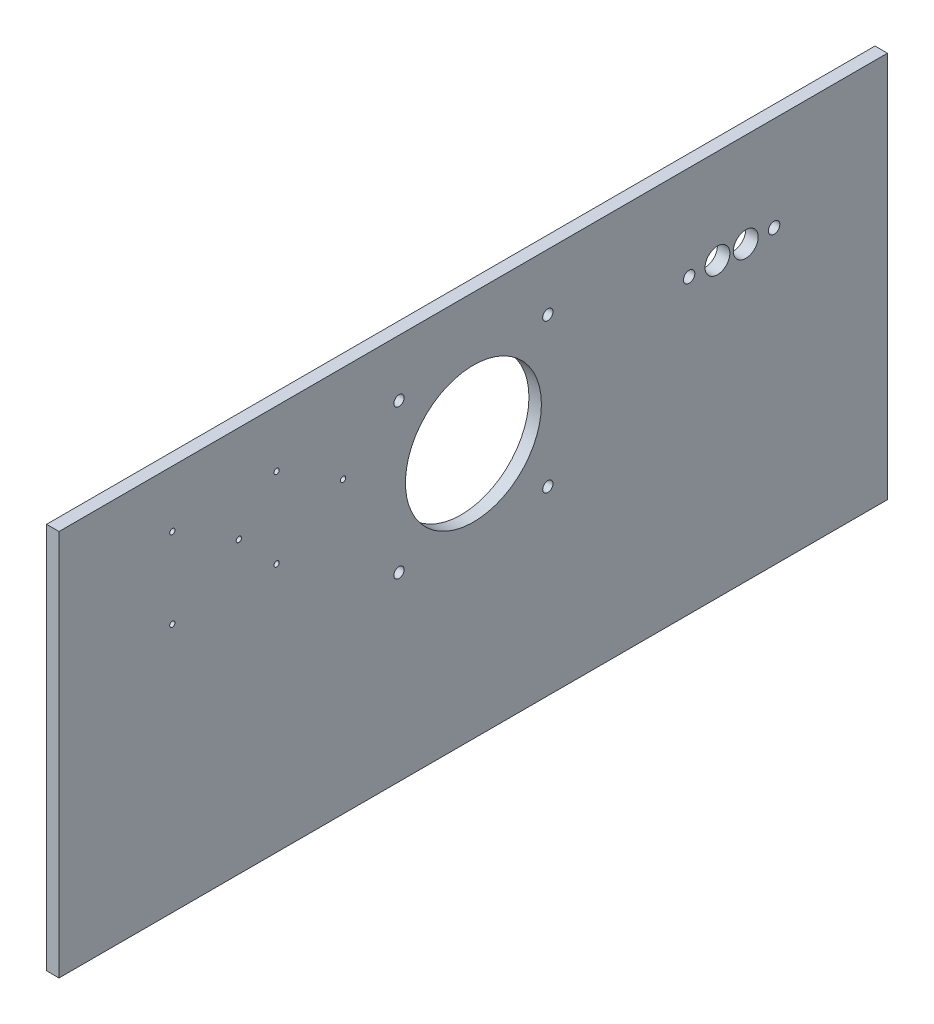
ISO-10303-21;
HEADER;
FILE_DESCRIPTION(('STEP AP214'),'2;1');
FILE_NAME('part.step','',(''),(''),'','','');
FILE_SCHEMA(('AUTOMOTIVE_DESIGN { 1 0 10303 214 1 1 1 1 }'));
ENDSEC;
DATA;
#1=APPLICATION_CONTEXT('core data for automotive mechanical design processes');
#2=APPLICATION_PROTOCOL_DEFINITION('international standard','automotive_design',2000,#1);
#3=PRODUCT_CONTEXT('',#1,'mechanical');
#4=PRODUCT('Part','Part','',(#3));
#5=PRODUCT_RELATED_PRODUCT_CATEGORY('part','',(#4));
#6=PRODUCT_DEFINITION_FORMATION('','',#4);
#7=PRODUCT_DEFINITION_CONTEXT('part definition',#1,'design');
#8=PRODUCT_DEFINITION('design','',#6,#7);
#9=PRODUCT_DEFINITION_SHAPE('','',#8);
#10=(LENGTH_UNIT() NAMED_UNIT(*) SI_UNIT(.MILLI.,.METRE.));
#11=(NAMED_UNIT(*) PLANE_ANGLE_UNIT() SI_UNIT($,.RADIAN.));
#12=(NAMED_UNIT(*) SI_UNIT($,.STERADIAN.) SOLID_ANGLE_UNIT());
#13=UNCERTAINTY_MEASURE_WITH_UNIT(LENGTH_MEASURE(1.E-05),#10,'distance_accuracy_value','');
#14=(GEOMETRIC_REPRESENTATION_CONTEXT(3) GLOBAL_UNCERTAINTY_ASSIGNED_CONTEXT((#13)) GLOBAL_UNIT_ASSIGNED_CONTEXT((#10,
#11,#12)) REPRESENTATION_CONTEXT('',''));
#15=CARTESIAN_POINT('',(0.,0.,0.));
#16=DIRECTION('',(0.,0.,1.));
#17=DIRECTION('',(1.,0.,0.));
#18=AXIS2_PLACEMENT_3D('',#15,#16,#17);
#19=CARTESIAN_POINT('',(4.191,0.,0.));
#20=DIRECTION('',(0.,0.,-1.));
#21=DIRECTION('',(-1.,0.,0.));
#22=AXIS2_PLACEMENT_3D('',#19,#20,#21);
#23=PLANE('',#22);
#24=DIRECTION('',(0.,-1.,0.));
#25=VECTOR('',#24,1.);
#26=CARTESIAN_POINT('',(0.,0.,0.));
#27=LINE('',#26,#25);
#28=CARTESIAN_POINT('',(0.,129.9972,0.));
#29=VERTEX_POINT('',#28);
#30=CARTESIAN_POINT('',(0.,0.,0.));
#31=VERTEX_POINT('',#30);
#32=EDGE_CURVE('E98',#29,#31,#27,.T.);
#33=ORIENTED_EDGE('',*,*,#32,.T.);
#34=DIRECTION('',(-1.,0.,0.));
#35=VECTOR('',#34,1.);
#36=CARTESIAN_POINT('',(4.191,0.,0.));
#37=LINE('',#36,#35);
#38=CARTESIAN_POINT('',(4.191,0.,0.));
#39=VERTEX_POINT('',#38);
#40=EDGE_CURVE('E11',#39,#31,#37,.T.);
#41=ORIENTED_EDGE('',*,*,#40,.F.);
#42=DIRECTION('',(0.,-1.,0.));
#43=VECTOR('',#42,1.);
#44=CARTESIAN_POINT('',(4.191,0.,0.));
#45=LINE('',#44,#43);
#46=CARTESIAN_POINT('',(4.191,129.9972,0.));
#47=VERTEX_POINT('',#46);
#48=EDGE_CURVE('E86',#47,#39,#45,.T.);
#49=ORIENTED_EDGE('',*,*,#48,.F.);
#50=DIRECTION('',(-1.,0.,0.));
#51=VECTOR('',#50,1.);
#52=CARTESIAN_POINT('',(4.191,129.9972,0.));
#53=LINE('',#52,#51);
#54=EDGE_CURVE('E94',#47,#29,#53,.T.);
#55=ORIENTED_EDGE('',*,*,#54,.T.);
#56=EDGE_LOOP('',(#33,#41,#49,#55));
#57=FACE_BOUND('',#56,.T.);
#58=ADVANCED_FACE('F35',(#57),#23,.F.);
#59=CARTESIAN_POINT('',(4.191,0.,0.));
#60=DIRECTION('',(0.,1.,0.));
#61=DIRECTION('',(0.,0.,1.));
#62=AXIS2_PLACEMENT_3D('',#59,#60,#61);
#63=PLANE('',#62);
#64=DIRECTION('',(0.,0.,-1.));
#65=VECTOR('',#64,1.);
#66=CARTESIAN_POINT('',(0.,0.,0.));
#67=LINE('',#66,#65);
#68=CARTESIAN_POINT('',(0.,0.,-278.511));
#69=VERTEX_POINT('',#68);
#70=EDGE_CURVE('E90',#31,#69,#67,.T.);
#71=ORIENTED_EDGE('',*,*,#70,.T.);
#72=DIRECTION('',(-1.,0.,0.));
#73=VECTOR('',#72,1.);
#74=CARTESIAN_POINT('',(4.191,0.,-278.511));
#75=LINE('',#74,#73);
#76=CARTESIAN_POINT('',(4.191,0.,-278.511));
#77=VERTEX_POINT('',#76);
#78=EDGE_CURVE('E43',#77,#69,#75,.T.);
#79=ORIENTED_EDGE('',*,*,#78,.F.);
#80=DIRECTION('',(0.,0.,-1.));
#81=VECTOR('',#80,1.);
#82=CARTESIAN_POINT('',(4.191,0.,0.));
#83=LINE('',#82,#81);
#84=EDGE_CURVE('E81',#39,#77,#83,.T.);
#85=ORIENTED_EDGE('',*,*,#84,.F.);
#86=ORIENTED_EDGE('',*,*,#40,.T.);
#87=EDGE_LOOP('',(#71,#79,#85,#86));
#88=FACE_BOUND('',#87,.T.);
#89=ADVANCED_FACE('F89',(#88),#63,.F.);
#90=CARTESIAN_POINT('',(4.191,0.,-278.511));
#91=DIRECTION('',(0.,0.,1.));
#92=DIRECTION('',(1.,0.,0.));
#93=AXIS2_PLACEMENT_3D('',#90,#91,#92);
#94=PLANE('',#93);
#95=DIRECTION('',(0.,1.,0.));
#96=VECTOR('',#95,1.);
#97=CARTESIAN_POINT('',(0.,0.,-278.511));
#98=LINE('',#97,#96);
#99=CARTESIAN_POINT('',(0.,129.9972,-278.511));
#100=VERTEX_POINT('',#99);
#101=EDGE_CURVE('E68',#69,#100,#98,.T.);
#102=ORIENTED_EDGE('',*,*,#101,.T.);
#103=DIRECTION('',(-1.,0.,0.));
#104=VECTOR('',#103,1.);
#105=CARTESIAN_POINT('',(4.191,129.9972,-278.511));
#106=LINE('',#105,#104);
#107=CARTESIAN_POINT('',(4.191,129.9972,-278.511));
#108=VERTEX_POINT('',#107);
#109=EDGE_CURVE('E91',#108,#100,#106,.T.);
#110=ORIENTED_EDGE('',*,*,#109,.F.);
#111=DIRECTION('',(0.,1.,0.));
#112=VECTOR('',#111,1.);
#113=CARTESIAN_POINT('',(4.191,0.,-278.511));
#114=LINE('',#113,#112);
#115=EDGE_CURVE('E84',#77,#108,#114,.T.);
#116=ORIENTED_EDGE('',*,*,#115,.F.);
#117=ORIENTED_EDGE('',*,*,#78,.T.);
#118=EDGE_LOOP('',(#102,#110,#116,#117));
#119=FACE_BOUND('',#118,.T.);
#120=ADVANCED_FACE('F92',(#119),#94,.F.);
#121=CARTESIAN_POINT('',(4.191,129.9972,0.));
#122=DIRECTION('',(0.,-1.,0.));
#123=DIRECTION('',(0.,0.,-1.));
#124=AXIS2_PLACEMENT_3D('',#121,#122,#123);
#125=PLANE('',#124);
#126=DIRECTION('',(0.,0.,1.));
#127=VECTOR('',#126,1.);
#128=CARTESIAN_POINT('',(0.,129.9972,0.));
#129=LINE('',#128,#127);
#130=EDGE_CURVE('E74',#100,#29,#129,.T.);
#131=ORIENTED_EDGE('',*,*,#130,.T.);
#132=ORIENTED_EDGE('',*,*,#54,.F.);
#133=DIRECTION('',(0.,0.,1.));
#134=VECTOR('',#133,1.);
#135=CARTESIAN_POINT('',(4.191,129.9972,0.));
#136=LINE('',#135,#134);
#137=EDGE_CURVE('E51',#108,#47,#136,.T.);
#138=ORIENTED_EDGE('',*,*,#137,.F.);
#139=ORIENTED_EDGE('',*,*,#109,.T.);
#140=EDGE_LOOP('',(#131,#132,#138,#139));
#141=FACE_BOUND('',#140,.T.);
#142=ADVANCED_FACE('F106',(#141),#125,.F.);
#143=CARTESIAN_POINT('',(4.191,0.,0.));
#144=DIRECTION('',(-1.,0.,0.));
#145=DIRECTION('',(0.,0.,1.));
#146=AXIS2_PLACEMENT_3D('',#143,#144,#145);
#147=PLANE('',#146);
#148=CARTESIAN_POINT('',(4.191,98.2472,-240.411));
#149=DIRECTION('',(1.,0.,0.));
#150=DIRECTION('',(0.,0.,-1.));
#151=AXIS2_PLACEMENT_3D('',#148,#149,#150);
#152=CIRCLE('',#151,1.90499999999999);
#153=CARTESIAN_POINT('',(4.191,98.2472,-242.316));
#154=VERTEX_POINT('',#153);
#155=EDGE_CURVE('E193',#154,#154,#152,.T.);
#156=ORIENTED_EDGE('',*,*,#155,.F.);
#157=EDGE_LOOP('',(#156));
#158=FACE_BOUND('',#157,.T.);
#159=CARTESIAN_POINT('',(4.191,98.2472,-230.886));
#160=DIRECTION('',(1.,0.,0.));
#161=DIRECTION('',(0.,0.,-1.));
#162=AXIS2_PLACEMENT_3D('',#159,#160,#161);
#163=CIRCLE('',#162,4.1656);
#164=CARTESIAN_POINT('',(4.191,98.2472,-235.0516));
#165=VERTEX_POINT('',#164);
#166=EDGE_CURVE('E187',#165,#165,#163,.T.);
#167=ORIENTED_EDGE('',*,*,#166,.F.);
#168=EDGE_LOOP('',(#167));
#169=FACE_BOUND('',#168,.T.);
#170=CARTESIAN_POINT('',(4.191,98.2472,-211.836));
#171=DIRECTION('',(1.,0.,0.));
#172=DIRECTION('',(0.,0.,-1.));
#173=AXIS2_PLACEMENT_3D('',#170,#171,#172);
#174=CIRCLE('',#173,1.90499999999999);
#175=CARTESIAN_POINT('',(4.191,98.2472,-213.741));
#176=VERTEX_POINT('',#175);
#177=EDGE_CURVE('E181',#176,#176,#174,.T.);
#178=ORIENTED_EDGE('',*,*,#177,.F.);
#179=EDGE_LOOP('',(#178));
#180=FACE_BOUND('',#179,.T.);
#181=CARTESIAN_POINT('',(4.191,98.2472,-221.361));
#182=DIRECTION('',(1.,0.,0.));
#183=DIRECTION('',(0.,0.,-1.));
#184=AXIS2_PLACEMENT_3D('',#181,#182,#183);
#185=CIRCLE('',#184,4.1656);
#186=CARTESIAN_POINT('',(4.191,98.2472,-225.5266));
#187=VERTEX_POINT('',#186);
#188=EDGE_CURVE('E175',#187,#187,#185,.T.);
#189=ORIENTED_EDGE('',*,*,#188,.F.);
#190=EDGE_LOOP('',(#189));
#191=FACE_BOUND('',#190,.T.);
#192=CARTESIAN_POINT('',(4.191,85.9282,-139.319));
#193=DIRECTION('',(1.,0.,0.));
#194=DIRECTION('',(0.,0.,-1.));
#195=AXIS2_PLACEMENT_3D('',#192,#193,#194);
#196=CIRCLE('',#195,22.86);
#197=CARTESIAN_POINT('',(4.191,85.9282,-162.179));
#198=VERTEX_POINT('',#197);
#199=EDGE_CURVE('E171',#198,#198,#196,.T.);
#200=ORIENTED_EDGE('',*,*,#199,.F.);
#201=EDGE_LOOP('',(#200));
#202=FACE_BOUND('',#201,.T.);
#203=CARTESIAN_POINT('',(4.191,60.9092,-114.3));
#204=DIRECTION('',(1.,0.,0.));
#205=DIRECTION('',(0.,0.,-1.));
#206=AXIS2_PLACEMENT_3D('',#203,#204,#205);
#207=CIRCLE('',#206,1.7272);
#208=CARTESIAN_POINT('',(4.191,60.9092,-116.0272));
#209=VERTEX_POINT('',#208);
#210=EDGE_CURVE('E168',#209,#209,#207,.T.);
#211=ORIENTED_EDGE('',*,*,#210,.F.);
#212=EDGE_LOOP('',(#211));
#213=FACE_BOUND('',#212,.T.);
#214=CARTESIAN_POINT('',(4.191,110.9472,-114.3));
#215=DIRECTION('',(1.,0.,0.));
#216=DIRECTION('',(0.,0.,-1.));
#217=AXIS2_PLACEMENT_3D('',#214,#215,#216);
#218=CIRCLE('',#217,1.7272);
#219=CARTESIAN_POINT('',(4.191,110.9472,-116.0272));
#220=VERTEX_POINT('',#219);
#221=EDGE_CURVE('E162',#220,#220,#218,.T.);
#222=ORIENTED_EDGE('',*,*,#221,.F.);
#223=EDGE_LOOP('',(#222));
#224=FACE_BOUND('',#223,.T.);
#225=CARTESIAN_POINT('',(4.191,110.9472,-164.338));
#226=DIRECTION('',(1.,0.,0.));
#227=DIRECTION('',(0.,0.,-1.));
#228=AXIS2_PLACEMENT_3D('',#225,#226,#227);
#229=CIRCLE('',#228,1.7272);
#230=CARTESIAN_POINT('',(4.191,110.9472,-166.0652));
#231=VERTEX_POINT('',#230);
#232=EDGE_CURVE('E156',#231,#231,#229,.T.);
#233=ORIENTED_EDGE('',*,*,#232,.F.);
#234=EDGE_LOOP('',(#233));
#235=FACE_BOUND('',#234,.T.);
#236=CARTESIAN_POINT('',(4.191,60.9092,-164.338));
#237=DIRECTION('',(1.,0.,0.));
#238=DIRECTION('',(0.,0.,-1.));
#239=AXIS2_PLACEMENT_3D('',#236,#237,#238);
#240=CIRCLE('',#239,1.7272);
#241=CARTESIAN_POINT('',(4.191,60.9092,-166.0652));
#242=VERTEX_POINT('',#241);
#243=EDGE_CURVE('E150',#242,#242,#240,.T.);
#244=ORIENTED_EDGE('',*,*,#243,.F.);
#245=EDGE_LOOP('',(#244));
#246=FACE_BOUND('',#245,.T.);
#247=CARTESIAN_POINT('',(4.191,83.9724,-38.1));
#248=DIRECTION('',(1.,0.,0.));
#249=DIRECTION('',(0.,0.,-1.));
#250=AXIS2_PLACEMENT_3D('',#247,#248,#249);
#251=CIRCLE('',#250,0.888999999999987);
#252=CARTESIAN_POINT('',(4.191,83.9724,-38.989));
#253=VERTEX_POINT('',#252);
#254=EDGE_CURVE('E144',#253,#253,#251,.T.);
#255=ORIENTED_EDGE('',*,*,#254,.F.);
#256=EDGE_LOOP('',(#255));
#257=FACE_BOUND('',#256,.T.);
#258=CARTESIAN_POINT('',(4.191,110.9472,-38.1));
#259=DIRECTION('',(1.,0.,0.));
#260=DIRECTION('',(0.,0.,-1.));
#261=AXIS2_PLACEMENT_3D('',#258,#259,#260);
#262=CIRCLE('',#261,0.888999999999987);
#263=CARTESIAN_POINT('',(4.191,110.9472,-38.989));
#264=VERTEX_POINT('',#263);
#265=EDGE_CURVE('E138',#264,#264,#262,.T.);
#266=ORIENTED_EDGE('',*,*,#265,.F.);
#267=EDGE_LOOP('',(#266));
#268=FACE_BOUND('',#267,.T.);
#269=CARTESIAN_POINT('',(4.191,97.4598,-60.452));
#270=DIRECTION('',(1.,0.,0.));
#271=DIRECTION('',(0.,0.,-1.));
#272=AXIS2_PLACEMENT_3D('',#269,#270,#271);
#273=CIRCLE('',#272,0.888999999999987);
#274=CARTESIAN_POINT('',(4.191,97.4598,-61.341));
#275=VERTEX_POINT('',#274);
#276=EDGE_CURVE('E132',#275,#275,#273,.T.);
#277=ORIENTED_EDGE('',*,*,#276,.F.);
#278=EDGE_LOOP('',(#277));
#279=FACE_BOUND('',#278,.T.);
#280=CARTESIAN_POINT('',(4.191,110.9472,-73.152));
#281=DIRECTION('',(1.,0.,0.));
#282=DIRECTION('',(0.,0.,-1.));
#283=AXIS2_PLACEMENT_3D('',#280,#281,#282);
#284=CIRCLE('',#283,0.888999999999987);
#285=CARTESIAN_POINT('',(4.191,110.9472,-74.041));
#286=VERTEX_POINT('',#285);
#287=EDGE_CURVE('E126',#286,#286,#284,.T.);
#288=ORIENTED_EDGE('',*,*,#287,.F.);
#289=EDGE_LOOP('',(#288));
#290=FACE_BOUND('',#289,.T.);
#291=CARTESIAN_POINT('',(4.191,83.9724,-73.152));
#292=DIRECTION('',(1.,0.,0.));
#293=DIRECTION('',(0.,0.,-1.));
#294=AXIS2_PLACEMENT_3D('',#291,#292,#293);
#295=CIRCLE('',#294,0.888999999999987);
#296=CARTESIAN_POINT('',(4.191,83.9724,-74.041));
#297=VERTEX_POINT('',#296);
#298=EDGE_CURVE('E120',#297,#297,#295,.T.);
#299=ORIENTED_EDGE('',*,*,#298,.F.);
#300=EDGE_LOOP('',(#299));
#301=FACE_BOUND('',#300,.T.);
#302=CARTESIAN_POINT('',(4.191,97.4598,-95.504));
#303=DIRECTION('',(1.,0.,0.));
#304=DIRECTION('',(0.,0.,-1.));
#305=AXIS2_PLACEMENT_3D('',#302,#303,#304);
#306=CIRCLE('',#305,0.888999999999987);
#307=CARTESIAN_POINT('',(4.191,97.4598,-96.393));
#308=VERTEX_POINT('',#307);
#309=EDGE_CURVE('E114',#308,#308,#306,.T.);
#310=ORIENTED_EDGE('',*,*,#309,.F.);
#311=EDGE_LOOP('',(#310));
#312=FACE_BOUND('',#311,.T.);
#313=ORIENTED_EDGE('',*,*,#48,.T.);
#314=ORIENTED_EDGE('',*,*,#84,.T.);
#315=ORIENTED_EDGE('',*,*,#115,.T.);
#316=ORIENTED_EDGE('',*,*,#137,.T.);
#317=EDGE_LOOP('',(#313,#314,#315,#316));
#318=FACE_BOUND('',#317,.T.);
#319=ADVANCED_FACE('F82',(#158,#169,#180,#191,#202,#213,#224,#235,#246,#257,#268,#279,#290,#301,
#312,#318),#147,.F.);
#320=CARTESIAN_POINT('',(0.,0.,0.));
#321=DIRECTION('',(-1.,0.,0.));
#322=DIRECTION('',(0.,0.,1.));
#323=AXIS2_PLACEMENT_3D('',#320,#321,#322);
#324=PLANE('',#323);
#325=CARTESIAN_POINT('',(0.,98.2472,-240.411));
#326=DIRECTION('',(-1.,0.,0.));
#327=DIRECTION('',(0.,0.,1.));
#328=AXIS2_PLACEMENT_3D('',#325,#326,#327);
#329=CIRCLE('',#328,1.90499999999999);
#330=CARTESIAN_POINT('',(0.,98.2472,-238.506));
#331=VERTEX_POINT('',#330);
#332=EDGE_CURVE('E196',#331,#331,#329,.F.);
#333=ORIENTED_EDGE('',*,*,#332,.T.);
#334=EDGE_LOOP('',(#333));
#335=FACE_BOUND('',#334,.T.);
#336=CARTESIAN_POINT('',(0.,98.2472,-230.886));
#337=DIRECTION('',(-1.,0.,0.));
#338=DIRECTION('',(0.,0.,1.));
#339=AXIS2_PLACEMENT_3D('',#336,#337,#338);
#340=CIRCLE('',#339,4.1656);
#341=CARTESIAN_POINT('',(0.,98.2472,-226.7204));
#342=VERTEX_POINT('',#341);
#343=EDGE_CURVE('E190',#342,#342,#340,.F.);
#344=ORIENTED_EDGE('',*,*,#343,.T.);
#345=EDGE_LOOP('',(#344));
#346=FACE_BOUND('',#345,.T.);
#347=CARTESIAN_POINT('',(0.,98.2472,-211.836));
#348=DIRECTION('',(-1.,0.,0.));
#349=DIRECTION('',(0.,0.,1.));
#350=AXIS2_PLACEMENT_3D('',#347,#348,#349);
#351=CIRCLE('',#350,1.90499999999999);
#352=CARTESIAN_POINT('',(0.,98.2472,-209.931));
#353=VERTEX_POINT('',#352);
#354=EDGE_CURVE('E184',#353,#353,#351,.F.);
#355=ORIENTED_EDGE('',*,*,#354,.T.);
#356=EDGE_LOOP('',(#355));
#357=FACE_BOUND('',#356,.T.);
#358=CARTESIAN_POINT('',(0.,98.2472,-221.361));
#359=DIRECTION('',(-1.,0.,0.));
#360=DIRECTION('',(0.,0.,1.));
#361=AXIS2_PLACEMENT_3D('',#358,#359,#360);
#362=CIRCLE('',#361,4.1656);
#363=CARTESIAN_POINT('',(0.,98.2472,-217.1954));
#364=VERTEX_POINT('',#363);
#365=EDGE_CURVE('E178',#364,#364,#362,.F.);
#366=ORIENTED_EDGE('',*,*,#365,.T.);
#367=EDGE_LOOP('',(#366));
#368=FACE_BOUND('',#367,.T.);
#369=CARTESIAN_POINT('',(0.,85.9282,-139.319));
#370=DIRECTION('',(-1.,0.,0.));
#371=DIRECTION('',(0.,0.,1.));
#372=AXIS2_PLACEMENT_3D('',#369,#370,#371);
#373=CIRCLE('',#372,22.86);
#374=CARTESIAN_POINT('',(0.,85.9282,-116.459));
#375=VERTEX_POINT('',#374);
#376=EDGE_CURVE('E172',#375,#375,#373,.F.);
#377=ORIENTED_EDGE('',*,*,#376,.T.);
#378=EDGE_LOOP('',(#377));
#379=FACE_BOUND('',#378,.T.);
#380=CARTESIAN_POINT('',(0.,60.9092,-114.3));
#381=DIRECTION('',(1.,0.,0.));
#382=DIRECTION('',(0.,0.,-1.));
#383=AXIS2_PLACEMENT_3D('',#380,#381,#382);
#384=CIRCLE('',#383,1.7272);
#385=CARTESIAN_POINT('',(0.,60.9092,-116.0272));
#386=VERTEX_POINT('',#385);
#387=EDGE_CURVE('E165',#386,#386,#384,.T.);
#388=ORIENTED_EDGE('',*,*,#387,.T.);
#389=EDGE_LOOP('',(#388));
#390=FACE_BOUND('',#389,.T.);
#391=CARTESIAN_POINT('',(0.,110.9472,-114.3));
#392=DIRECTION('',(1.,0.,0.));
#393=DIRECTION('',(0.,0.,-1.));
#394=AXIS2_PLACEMENT_3D('',#391,#392,#393);
#395=CIRCLE('',#394,1.7272);
#396=CARTESIAN_POINT('',(0.,110.9472,-116.0272));
#397=VERTEX_POINT('',#396);
#398=EDGE_CURVE('E159',#397,#397,#395,.T.);
#399=ORIENTED_EDGE('',*,*,#398,.T.);
#400=EDGE_LOOP('',(#399));
#401=FACE_BOUND('',#400,.T.);
#402=CARTESIAN_POINT('',(0.,110.9472,-164.338));
#403=DIRECTION('',(1.,0.,0.));
#404=DIRECTION('',(0.,0.,-1.));
#405=AXIS2_PLACEMENT_3D('',#402,#403,#404);
#406=CIRCLE('',#405,1.7272);
#407=CARTESIAN_POINT('',(0.,110.9472,-166.0652));
#408=VERTEX_POINT('',#407);
#409=EDGE_CURVE('E153',#408,#408,#406,.T.);
#410=ORIENTED_EDGE('',*,*,#409,.T.);
#411=EDGE_LOOP('',(#410));
#412=FACE_BOUND('',#411,.T.);
#413=CARTESIAN_POINT('',(0.,60.9092,-164.338));
#414=DIRECTION('',(1.,0.,0.));
#415=DIRECTION('',(0.,0.,-1.));
#416=AXIS2_PLACEMENT_3D('',#413,#414,#415);
#417=CIRCLE('',#416,1.7272);
#418=CARTESIAN_POINT('',(0.,60.9092,-166.0652));
#419=VERTEX_POINT('',#418);
#420=EDGE_CURVE('E147',#419,#419,#417,.T.);
#421=ORIENTED_EDGE('',*,*,#420,.T.);
#422=EDGE_LOOP('',(#421));
#423=FACE_BOUND('',#422,.T.);
#424=CARTESIAN_POINT('',(0.,83.9724,-38.1));
#425=DIRECTION('',(1.,0.,0.));
#426=DIRECTION('',(0.,0.,-1.));
#427=AXIS2_PLACEMENT_3D('',#424,#425,#426);
#428=CIRCLE('',#427,0.889000000000001);
#429=CARTESIAN_POINT('',(0.,83.9724,-38.989));
#430=VERTEX_POINT('',#429);
#431=EDGE_CURVE('E141',#430,#430,#428,.T.);
#432=ORIENTED_EDGE('',*,*,#431,.T.);
#433=EDGE_LOOP('',(#432));
#434=FACE_BOUND('',#433,.T.);
#435=CARTESIAN_POINT('',(0.,110.9472,-38.1));
#436=DIRECTION('',(1.,0.,0.));
#437=DIRECTION('',(0.,0.,-1.));
#438=AXIS2_PLACEMENT_3D('',#435,#436,#437);
#439=CIRCLE('',#438,0.889000000000001);
#440=CARTESIAN_POINT('',(0.,110.9472,-38.989));
#441=VERTEX_POINT('',#440);
#442=EDGE_CURVE('E135',#441,#441,#439,.T.);
#443=ORIENTED_EDGE('',*,*,#442,.T.);
#444=EDGE_LOOP('',(#443));
#445=FACE_BOUND('',#444,.T.);
#446=CARTESIAN_POINT('',(0.,97.4598,-60.452));
#447=DIRECTION('',(1.,0.,0.));
#448=DIRECTION('',(0.,0.,-1.));
#449=AXIS2_PLACEMENT_3D('',#446,#447,#448);
#450=CIRCLE('',#449,0.889000000000001);
#451=CARTESIAN_POINT('',(0.,97.4598,-61.341));
#452=VERTEX_POINT('',#451);
#453=EDGE_CURVE('E129',#452,#452,#450,.T.);
#454=ORIENTED_EDGE('',*,*,#453,.T.);
#455=EDGE_LOOP('',(#454));
#456=FACE_BOUND('',#455,.T.);
#457=CARTESIAN_POINT('',(0.,110.9472,-73.152));
#458=DIRECTION('',(1.,0.,0.));
#459=DIRECTION('',(0.,0.,-1.));
#460=AXIS2_PLACEMENT_3D('',#457,#458,#459);
#461=CIRCLE('',#460,0.889000000000001);
#462=CARTESIAN_POINT('',(0.,110.9472,-74.041));
#463=VERTEX_POINT('',#462);
#464=EDGE_CURVE('E123',#463,#463,#461,.T.);
#465=ORIENTED_EDGE('',*,*,#464,.T.);
#466=EDGE_LOOP('',(#465));
#467=FACE_BOUND('',#466,.T.);
#468=CARTESIAN_POINT('',(0.,83.9724,-73.152));
#469=DIRECTION('',(1.,0.,0.));
#470=DIRECTION('',(0.,0.,-1.));
#471=AXIS2_PLACEMENT_3D('',#468,#469,#470);
#472=CIRCLE('',#471,0.889000000000001);
#473=CARTESIAN_POINT('',(0.,83.9724,-74.041));
#474=VERTEX_POINT('',#473);
#475=EDGE_CURVE('E117',#474,#474,#472,.T.);
#476=ORIENTED_EDGE('',*,*,#475,.T.);
#477=EDGE_LOOP('',(#476));
#478=FACE_BOUND('',#477,.T.);
#479=CARTESIAN_POINT('',(0.,97.4598,-95.504));
#480=DIRECTION('',(1.,0.,0.));
#481=DIRECTION('',(0.,0.,-1.));
#482=AXIS2_PLACEMENT_3D('',#479,#480,#481);
#483=CIRCLE('',#482,0.889000000000001);
#484=CARTESIAN_POINT('',(0.,97.4598,-96.393));
#485=VERTEX_POINT('',#484);
#486=EDGE_CURVE('E101',#485,#485,#483,.T.);
#487=ORIENTED_EDGE('',*,*,#486,.T.);
#488=EDGE_LOOP('',(#487));
#489=FACE_BOUND('',#488,.T.);
#490=ORIENTED_EDGE('',*,*,#32,.F.);
#491=ORIENTED_EDGE('',*,*,#130,.F.);
#492=ORIENTED_EDGE('',*,*,#101,.F.);
#493=ORIENTED_EDGE('',*,*,#70,.F.);
#494=EDGE_LOOP('',(#490,#491,#492,#493));
#495=FACE_BOUND('',#494,.T.);
#496=ADVANCED_FACE('F109',(#335,#346,#357,#368,#379,#390,#401,#412,#423,#434,#445,#456,#467,
#478,#489,#495),#324,.T.);
#497=CARTESIAN_POINT('',(4.191,97.4598,-95.504));
#498=DIRECTION('',(1.,0.,0.));
#499=DIRECTION('',(0.,0.,-1.));
#500=AXIS2_PLACEMENT_3D('',#497,#498,#499);
#501=CYLINDRICAL_SURFACE('',#500,0.888999999999994);
#502=ORIENTED_EDGE('',*,*,#486,.F.);
#503=EDGE_LOOP('',(#502));
#504=FACE_BOUND('',#503,.T.);
#505=ORIENTED_EDGE('',*,*,#309,.T.);
#506=EDGE_LOOP('',(#505));
#507=FACE_BOUND('',#506,.T.);
#508=ADVANCED_FACE('F235',(#504,#507),#501,.F.);
#509=CARTESIAN_POINT('',(4.191,83.9724,-73.152));
#510=DIRECTION('',(1.,0.,0.));
#511=DIRECTION('',(0.,0.,-1.));
#512=AXIS2_PLACEMENT_3D('',#509,#510,#511);
#513=CYLINDRICAL_SURFACE('',#512,0.888999999999994);
#514=ORIENTED_EDGE('',*,*,#475,.F.);
#515=EDGE_LOOP('',(#514));
#516=FACE_BOUND('',#515,.T.);
#517=ORIENTED_EDGE('',*,*,#298,.T.);
#518=EDGE_LOOP('',(#517));
#519=FACE_BOUND('',#518,.T.);
#520=ADVANCED_FACE('F237',(#516,#519),#513,.F.);
#521=CARTESIAN_POINT('',(4.191,110.9472,-73.152));
#522=DIRECTION('',(1.,0.,0.));
#523=DIRECTION('',(0.,0.,-1.));
#524=AXIS2_PLACEMENT_3D('',#521,#522,#523);
#525=CYLINDRICAL_SURFACE('',#524,0.888999999999994);
#526=ORIENTED_EDGE('',*,*,#464,.F.);
#527=EDGE_LOOP('',(#526));
#528=FACE_BOUND('',#527,.T.);
#529=ORIENTED_EDGE('',*,*,#287,.T.);
#530=EDGE_LOOP('',(#529));
#531=FACE_BOUND('',#530,.T.);
#532=ADVANCED_FACE('F244',(#528,#531),#525,.F.);
#533=CARTESIAN_POINT('',(4.191,97.4598,-60.452));
#534=DIRECTION('',(1.,0.,0.));
#535=DIRECTION('',(0.,0.,-1.));
#536=AXIS2_PLACEMENT_3D('',#533,#534,#535);
#537=CYLINDRICAL_SURFACE('',#536,0.888999999999994);
#538=ORIENTED_EDGE('',*,*,#453,.F.);
#539=EDGE_LOOP('',(#538));
#540=FACE_BOUND('',#539,.T.);
#541=ORIENTED_EDGE('',*,*,#276,.T.);
#542=EDGE_LOOP('',(#541));
#543=FACE_BOUND('',#542,.T.);
#544=ADVANCED_FACE('F348',(#540,#543),#537,.F.);
#545=CARTESIAN_POINT('',(4.191,110.9472,-38.1));
#546=DIRECTION('',(1.,0.,0.));
#547=DIRECTION('',(0.,0.,-1.));
#548=AXIS2_PLACEMENT_3D('',#545,#546,#547);
#549=CYLINDRICAL_SURFACE('',#548,0.888999999999994);
#550=ORIENTED_EDGE('',*,*,#442,.F.);
#551=EDGE_LOOP('',(#550));
#552=FACE_BOUND('',#551,.T.);
#553=ORIENTED_EDGE('',*,*,#265,.T.);
#554=EDGE_LOOP('',(#553));
#555=FACE_BOUND('',#554,.T.);
#556=ADVANCED_FACE('F344',(#552,#555),#549,.F.);
#557=CARTESIAN_POINT('',(4.191,83.9724,-38.1));
#558=DIRECTION('',(1.,0.,0.));
#559=DIRECTION('',(0.,0.,-1.));
#560=AXIS2_PLACEMENT_3D('',#557,#558,#559);
#561=CYLINDRICAL_SURFACE('',#560,0.888999999999994);
#562=ORIENTED_EDGE('',*,*,#431,.F.);
#563=EDGE_LOOP('',(#562));
#564=FACE_BOUND('',#563,.T.);
#565=ORIENTED_EDGE('',*,*,#254,.T.);
#566=EDGE_LOOP('',(#565));
#567=FACE_BOUND('',#566,.T.);
#568=ADVANCED_FACE('F340',(#564,#567),#561,.F.);
#569=CARTESIAN_POINT('',(4.191,60.9092,-164.338));
#570=DIRECTION('',(1.,0.,0.));
#571=DIRECTION('',(0.,0.,-1.));
#572=AXIS2_PLACEMENT_3D('',#569,#570,#571);
#573=CYLINDRICAL_SURFACE('',#572,1.7272);
#574=ORIENTED_EDGE('',*,*,#420,.F.);
#575=EDGE_LOOP('',(#574));
#576=FACE_BOUND('',#575,.T.);
#577=ORIENTED_EDGE('',*,*,#243,.T.);
#578=EDGE_LOOP('',(#577));
#579=FACE_BOUND('',#578,.T.);
#580=ADVANCED_FACE('F336',(#576,#579),#573,.F.);
#581=CARTESIAN_POINT('',(4.191,110.9472,-164.338));
#582=DIRECTION('',(1.,0.,0.));
#583=DIRECTION('',(0.,0.,-1.));
#584=AXIS2_PLACEMENT_3D('',#581,#582,#583);
#585=CYLINDRICAL_SURFACE('',#584,1.7272);
#586=ORIENTED_EDGE('',*,*,#409,.F.);
#587=EDGE_LOOP('',(#586));
#588=FACE_BOUND('',#587,.T.);
#589=ORIENTED_EDGE('',*,*,#232,.T.);
#590=EDGE_LOOP('',(#589));
#591=FACE_BOUND('',#590,.T.);
#592=ADVANCED_FACE('F332',(#588,#591),#585,.F.);
#593=CARTESIAN_POINT('',(4.191,110.9472,-114.3));
#594=DIRECTION('',(1.,0.,0.));
#595=DIRECTION('',(0.,0.,-1.));
#596=AXIS2_PLACEMENT_3D('',#593,#594,#595);
#597=CYLINDRICAL_SURFACE('',#596,1.7272);
#598=ORIENTED_EDGE('',*,*,#398,.F.);
#599=EDGE_LOOP('',(#598));
#600=FACE_BOUND('',#599,.T.);
#601=ORIENTED_EDGE('',*,*,#221,.T.);
#602=EDGE_LOOP('',(#601));
#603=FACE_BOUND('',#602,.T.);
#604=ADVANCED_FACE('F328',(#600,#603),#597,.F.);
#605=CARTESIAN_POINT('',(4.191,60.9092,-114.3));
#606=DIRECTION('',(1.,0.,0.));
#607=DIRECTION('',(0.,0.,-1.));
#608=AXIS2_PLACEMENT_3D('',#605,#606,#607);
#609=CYLINDRICAL_SURFACE('',#608,1.7272);
#610=ORIENTED_EDGE('',*,*,#387,.F.);
#611=EDGE_LOOP('',(#610));
#612=FACE_BOUND('',#611,.T.);
#613=ORIENTED_EDGE('',*,*,#210,.T.);
#614=EDGE_LOOP('',(#613));
#615=FACE_BOUND('',#614,.T.);
#616=ADVANCED_FACE('F324',(#612,#615),#609,.F.);
#617=CARTESIAN_POINT('',(-0.00100000000000013,85.9282,-139.319));
#618=DIRECTION('',(1.,0.,0.));
#619=DIRECTION('',(0.,0.,-1.));
#620=AXIS2_PLACEMENT_3D('',#617,#618,#619);
#621=CYLINDRICAL_SURFACE('',#620,22.86);
#622=ORIENTED_EDGE('',*,*,#376,.F.);
#623=EDGE_LOOP('',(#622));
#624=FACE_BOUND('',#623,.T.);
#625=ORIENTED_EDGE('',*,*,#199,.T.);
#626=EDGE_LOOP('',(#625));
#627=FACE_BOUND('',#626,.T.);
#628=ADVANCED_FACE('F286',(#624,#627),#621,.F.);
#629=CARTESIAN_POINT('',(-0.00100000000000013,98.2472,-221.361));
#630=DIRECTION('',(1.,0.,0.));
#631=DIRECTION('',(0.,0.,-1.));
#632=AXIS2_PLACEMENT_3D('',#629,#630,#631);
#633=CYLINDRICAL_SURFACE('',#632,4.1656);
#634=ORIENTED_EDGE('',*,*,#365,.F.);
#635=EDGE_LOOP('',(#634));
#636=FACE_BOUND('',#635,.T.);
#637=ORIENTED_EDGE('',*,*,#188,.T.);
#638=EDGE_LOOP('',(#637));
#639=FACE_BOUND('',#638,.T.);
#640=ADVANCED_FACE('F280',(#636,#639),#633,.F.);
#641=CARTESIAN_POINT('',(-0.00100000000000013,98.2472,-211.836));
#642=DIRECTION('',(1.,0.,0.));
#643=DIRECTION('',(0.,0.,-1.));
#644=AXIS2_PLACEMENT_3D('',#641,#642,#643);
#645=CYLINDRICAL_SURFACE('',#644,1.90499999999999);
#646=ORIENTED_EDGE('',*,*,#354,.F.);
#647=EDGE_LOOP('',(#646));
#648=FACE_BOUND('',#647,.T.);
#649=ORIENTED_EDGE('',*,*,#177,.T.);
#650=EDGE_LOOP('',(#649));
#651=FACE_BOUND('',#650,.T.);
#652=ADVANCED_FACE('F285',(#648,#651),#645,.F.);
#653=CARTESIAN_POINT('',(-0.00100000000000013,98.2472,-230.886));
#654=DIRECTION('',(1.,0.,0.));
#655=DIRECTION('',(0.,0.,-1.));
#656=AXIS2_PLACEMENT_3D('',#653,#654,#655);
#657=CYLINDRICAL_SURFACE('',#656,4.1656);
#658=ORIENTED_EDGE('',*,*,#343,.F.);
#659=EDGE_LOOP('',(#658));
#660=FACE_BOUND('',#659,.T.);
#661=ORIENTED_EDGE('',*,*,#166,.T.);
#662=EDGE_LOOP('',(#661));
#663=FACE_BOUND('',#662,.T.);
#664=ADVANCED_FACE('F298',(#660,#663),#657,.F.);
#665=CARTESIAN_POINT('',(-0.00100000000000013,98.2472,-240.411));
#666=DIRECTION('',(1.,0.,0.));
#667=DIRECTION('',(0.,0.,-1.));
#668=AXIS2_PLACEMENT_3D('',#665,#666,#667);
#669=CYLINDRICAL_SURFACE('',#668,1.90499999999999);
#670=ORIENTED_EDGE('',*,*,#332,.F.);
#671=EDGE_LOOP('',(#670));
#672=FACE_BOUND('',#671,.T.);
#673=ORIENTED_EDGE('',*,*,#155,.T.);
#674=EDGE_LOOP('',(#673));
#675=FACE_BOUND('',#674,.T.);
#676=ADVANCED_FACE('F202',(#672,#675),#669,.F.);
#677=CLOSED_SHELL('',(#58,#89,#120,#142,#319,#496,#508,#520,#532,#544,#556,#568,#580,#592,#604,
#616,#628,#640,#652,#664,#676));
#678=MANIFOLD_SOLID_BREP('B2',#677);
#679=ADVANCED_BREP_SHAPE_REPRESENTATION('',(#18,#678),#14);
#680=SHAPE_DEFINITION_REPRESENTATION(#9,#679);
ENDSEC;
END-ISO-10303-21;
